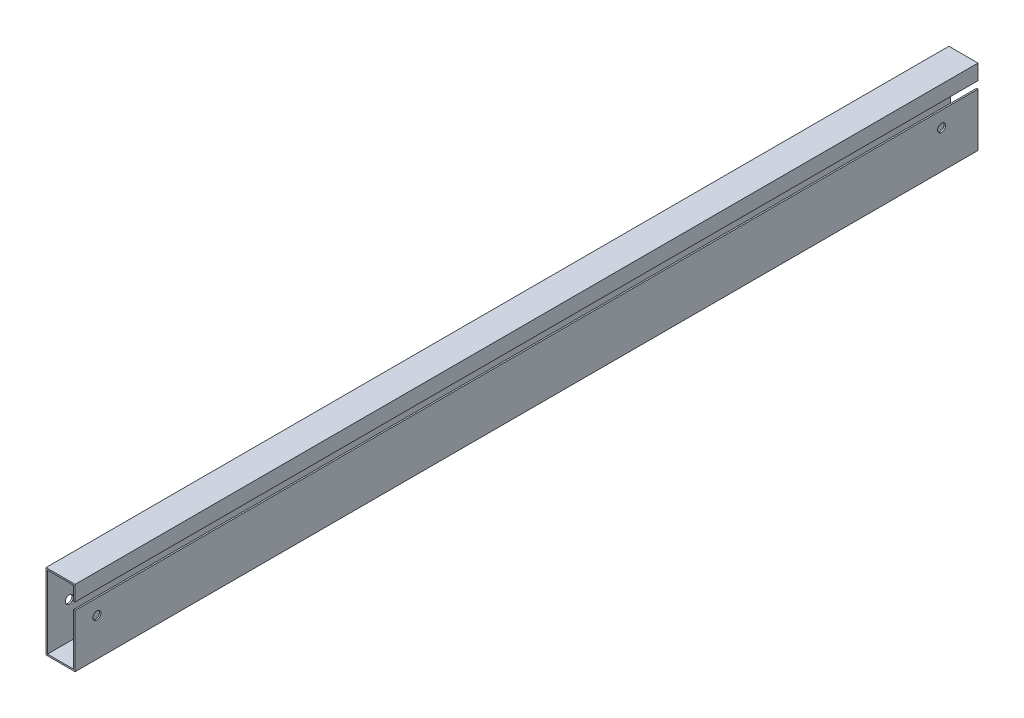
ISO-10303-21;
HEADER;
FILE_DESCRIPTION(('STEP AP214'),'2;1');
FILE_NAME('part.step','',(''),(''),'','','');
FILE_SCHEMA(('AUTOMOTIVE_DESIGN { 1 0 10303 214 1 1 1 1 }'));
ENDSEC;
DATA;
#1=APPLICATION_CONTEXT('core data for automotive mechanical design processes');
#2=APPLICATION_PROTOCOL_DEFINITION('international standard','automotive_design',2000,#1);
#3=PRODUCT_CONTEXT('',#1,'mechanical');
#4=PRODUCT('Part','Part','',(#3));
#5=PRODUCT_RELATED_PRODUCT_CATEGORY('part','',(#4));
#6=PRODUCT_DEFINITION_FORMATION('','',#4);
#7=PRODUCT_DEFINITION_CONTEXT('part definition',#1,'design');
#8=PRODUCT_DEFINITION('design','',#6,#7);
#9=PRODUCT_DEFINITION_SHAPE('','',#8);
#10=(LENGTH_UNIT() NAMED_UNIT(*) SI_UNIT(.MILLI.,.METRE.));
#11=(NAMED_UNIT(*) PLANE_ANGLE_UNIT() SI_UNIT($,.RADIAN.));
#12=(NAMED_UNIT(*) SI_UNIT($,.STERADIAN.) SOLID_ANGLE_UNIT());
#13=UNCERTAINTY_MEASURE_WITH_UNIT(LENGTH_MEASURE(1.E-05),#10,'distance_accuracy_value','');
#14=(GEOMETRIC_REPRESENTATION_CONTEXT(3) GLOBAL_UNCERTAINTY_ASSIGNED_CONTEXT((#13)) GLOBAL_UNIT_ASSIGNED_CONTEXT((#10,
#11,#12)) REPRESENTATION_CONTEXT('',''));
#15=CARTESIAN_POINT('',(0.,0.,0.));
#16=DIRECTION('',(0.,0.,1.));
#17=DIRECTION('',(1.,0.,0.));
#18=AXIS2_PLACEMENT_3D('',#15,#16,#17);
#19=CARTESIAN_POINT('',(9.99999999999999,26.,-620.));
#20=DIRECTION('',(1.,0.,0.));
#21=DIRECTION('',(0.,1.,0.));
#22=AXIS2_PLACEMENT_3D('',#19,#20,#21);
#23=PLANE('',#22);
#24=CARTESIAN_POINT('',(10.,0.,-595.));
#25=DIRECTION('',(1.,0.,0.));
#26=DIRECTION('',(0.,1.,0.));
#27=AXIS2_PLACEMENT_3D('',#24,#25,#26);
#28=CIRCLE('',#27,2.74999999999992);
#29=CARTESIAN_POINT('',(10.,2.74999999999992,-595.));
#30=VERTEX_POINT('',#29);
#31=EDGE_CURVE('E350',#30,#30,#28,.T.);
#32=ORIENTED_EDGE('',*,*,#31,.F.);
#33=EDGE_LOOP('',(#32));
#34=FACE_BOUND('',#33,.T.);
#35=DIRECTION('',(0.,0.,1.));
#36=VECTOR('',#35,1.);
#37=CARTESIAN_POINT('',(10.,10.5,-1200.));
#38=LINE('',#37,#36);
#39=CARTESIAN_POINT('',(10.,10.5,-620.));
#40=VERTEX_POINT('',#39);
#41=CARTESIAN_POINT('',(10.,10.5,0.));
#42=VERTEX_POINT('',#41);
#43=EDGE_CURVE('E135',#40,#42,#38,.T.);
#44=ORIENTED_EDGE('',*,*,#43,.T.);
#45=DIRECTION('',(0.,1.,0.));
#46=VECTOR('',#45,1.);
#47=CARTESIAN_POINT('',(9.99999999999999,26.,0.));
#48=LINE('',#47,#46);
#49=CARTESIAN_POINT('',(10.,-26.,0.));
#50=VERTEX_POINT('',#49);
#51=EDGE_CURVE('E154',#50,#42,#48,.T.);
#52=ORIENTED_EDGE('',*,*,#51,.F.);
#53=DIRECTION('',(0.,0.,1.));
#54=VECTOR('',#53,1.);
#55=CARTESIAN_POINT('',(10.,-26.,-620.));
#56=LINE('',#55,#54);
#57=CARTESIAN_POINT('',(10.,-26.,-620.));
#58=VERTEX_POINT('',#57);
#59=EDGE_CURVE('E179',#58,#50,#56,.T.);
#60=ORIENTED_EDGE('',*,*,#59,.F.);
#61=DIRECTION('',(0.,1.,0.));
#62=VECTOR('',#61,1.);
#63=CARTESIAN_POINT('',(9.99999999999999,26.,-620.));
#64=LINE('',#63,#62);
#65=EDGE_CURVE('E264',#58,#40,#64,.T.);
#66=ORIENTED_EDGE('',*,*,#65,.T.);
#67=EDGE_LOOP('',(#44,#52,#60,#66));
#68=FACE_BOUND('',#67,.T.);
#69=CARTESIAN_POINT('',(10.,0.,-15.));
#70=DIRECTION('',(1.,0.,0.));
#71=DIRECTION('',(0.,1.,0.));
#72=AXIS2_PLACEMENT_3D('',#69,#70,#71);
#73=CIRCLE('',#72,2.75);
#74=CARTESIAN_POINT('',(10.,2.75,-15.));
#75=VERTEX_POINT('',#74);
#76=EDGE_CURVE('E211',#75,#75,#73,.T.);
#77=ORIENTED_EDGE('',*,*,#76,.F.);
#78=EDGE_LOOP('',(#77));
#79=FACE_BOUND('',#78,.T.);
#80=ADVANCED_FACE('F39',(#34,#68,#79),#23,.T.);
#81=CARTESIAN_POINT('',(8.99999999999999,25.,-1200.));
#82=DIRECTION('',(1.,0.,0.));
#83=DIRECTION('',(0.,1.,0.));
#84=AXIS2_PLACEMENT_3D('',#81,#82,#83);
#85=PLANE('',#84);
#86=CARTESIAN_POINT('',(9.,0.,-595.));
#87=DIRECTION('',(1.,0.,0.));
#88=DIRECTION('',(0.,1.,0.));
#89=AXIS2_PLACEMENT_3D('',#86,#87,#88);
#90=CIRCLE('',#89,2.74999999999992);
#91=CARTESIAN_POINT('',(9.,2.74999999999992,-595.));
#92=VERTEX_POINT('',#91);
#93=EDGE_CURVE('E148',#92,#92,#90,.T.);
#94=ORIENTED_EDGE('',*,*,#93,.T.);
#95=EDGE_LOOP('',(#94));
#96=FACE_BOUND('',#95,.T.);
#97=CARTESIAN_POINT('',(9.,0.,-15.));
#98=DIRECTION('',(1.,0.,0.));
#99=DIRECTION('',(0.,1.,0.));
#100=AXIS2_PLACEMENT_3D('',#97,#98,#99);
#101=CIRCLE('',#100,2.75);
#102=CARTESIAN_POINT('',(9.,2.75,-15.));
#103=VERTEX_POINT('',#102);
#104=EDGE_CURVE('E194',#103,#103,#101,.T.);
#105=ORIENTED_EDGE('',*,*,#104,.T.);
#106=EDGE_LOOP('',(#105));
#107=FACE_BOUND('',#106,.T.);
#108=DIRECTION('',(0.,1.,0.));
#109=VECTOR('',#108,1.);
#110=CARTESIAN_POINT('',(8.99999999999999,25.,0.));
#111=LINE('',#110,#109);
#112=CARTESIAN_POINT('',(9.,-25.,0.));
#113=VERTEX_POINT('',#112);
#114=CARTESIAN_POINT('',(9.,10.5,0.));
#115=VERTEX_POINT('',#114);
#116=EDGE_CURVE('E225',#113,#115,#111,.T.);
#117=ORIENTED_EDGE('',*,*,#116,.T.);
#118=DIRECTION('',(0.,0.,-1.));
#119=VECTOR('',#118,1.);
#120=CARTESIAN_POINT('',(8.99999999999999,10.5,-1200.));
#121=LINE('',#120,#119);
#122=CARTESIAN_POINT('',(8.99999999999999,10.5,-620.));
#123=VERTEX_POINT('',#122);
#124=EDGE_CURVE('E11',#115,#123,#121,.T.);
#125=ORIENTED_EDGE('',*,*,#124,.T.);
#126=DIRECTION('',(0.,1.,0.));
#127=VECTOR('',#126,1.);
#128=CARTESIAN_POINT('',(9.,0.,-620.));
#129=LINE('',#128,#127);
#130=CARTESIAN_POINT('',(9.,-25.,-620.));
#131=VERTEX_POINT('',#130);
#132=EDGE_CURVE('E155',#131,#123,#129,.T.);
#133=ORIENTED_EDGE('',*,*,#132,.F.);
#134=DIRECTION('',(0.,0.,1.));
#135=VECTOR('',#134,1.);
#136=CARTESIAN_POINT('',(9.,-25.,-1200.));
#137=LINE('',#136,#135);
#138=EDGE_CURVE('E242',#131,#113,#137,.T.);
#139=ORIENTED_EDGE('',*,*,#138,.T.);
#140=EDGE_LOOP('',(#117,#125,#133,#139));
#141=FACE_BOUND('',#140,.T.);
#142=ADVANCED_FACE('F299',(#96,#107,#141),#85,.F.);
#143=DIRECTION('',(0.,0.,1.));
#144=VECTOR('',#143,1.);
#145=CARTESIAN_POINT('',(10.,15.5,-1200.));
#146=LINE('',#145,#144);
#147=CARTESIAN_POINT('',(10.,15.5,-620.));
#148=VERTEX_POINT('',#147);
#149=CARTESIAN_POINT('',(10.,15.5,0.));
#150=VERTEX_POINT('',#149);
#151=EDGE_CURVE('E127',#148,#150,#146,.T.);
#152=ORIENTED_EDGE('',*,*,#151,.F.);
#153=CARTESIAN_POINT('',(9.99999999999999,26.,-620.));
#154=VERTEX_POINT('',#153);
#155=EDGE_CURVE('E178',#148,#154,#64,.T.);
#156=ORIENTED_EDGE('',*,*,#155,.T.);
#157=DIRECTION('',(0.,0.,1.));
#158=VECTOR('',#157,1.);
#159=CARTESIAN_POINT('',(9.99999999999999,26.,-620.));
#160=LINE('',#159,#158);
#161=CARTESIAN_POINT('',(9.99999999999999,26.,0.));
#162=VERTEX_POINT('',#161);
#163=EDGE_CURVE('E151',#154,#162,#160,.T.);
#164=ORIENTED_EDGE('',*,*,#163,.T.);
#165=EDGE_CURVE('E143',#150,#162,#48,.T.);
#166=ORIENTED_EDGE('',*,*,#165,.F.);
#167=EDGE_LOOP('',(#152,#156,#164,#166));
#168=FACE_BOUND('',#167,.T.);
#169=ADVANCED_FACE('F41',(#168),#23,.T.);
#170=CARTESIAN_POINT('',(-10.,-26.,-620.));
#171=DIRECTION('',(0.,-1.,0.));
#172=DIRECTION('',(0.,0.,-1.));
#173=AXIS2_PLACEMENT_3D('',#170,#171,#172);
#174=PLANE('',#173);
#175=DIRECTION('',(1.,0.,0.));
#176=VECTOR('',#175,1.);
#177=CARTESIAN_POINT('',(-10.,-26.,0.));
#178=LINE('',#177,#176);
#179=CARTESIAN_POINT('',(-10.,-26.,0.));
#180=VERTEX_POINT('',#179);
#181=EDGE_CURVE('E174',#180,#50,#178,.T.);
#182=ORIENTED_EDGE('',*,*,#181,.F.);
#183=DIRECTION('',(0.,0.,1.));
#184=VECTOR('',#183,1.);
#185=CARTESIAN_POINT('',(-10.,-26.,-620.));
#186=LINE('',#185,#184);
#187=CARTESIAN_POINT('',(-10.,-26.,-620.));
#188=VERTEX_POINT('',#187);
#189=EDGE_CURVE('E182',#188,#180,#186,.T.);
#190=ORIENTED_EDGE('',*,*,#189,.F.);
#191=DIRECTION('',(1.,0.,0.));
#192=VECTOR('',#191,1.);
#193=CARTESIAN_POINT('',(-10.,-26.,-620.));
#194=LINE('',#193,#192);
#195=EDGE_CURVE('E166',#188,#58,#194,.T.);
#196=ORIENTED_EDGE('',*,*,#195,.T.);
#197=ORIENTED_EDGE('',*,*,#59,.T.);
#198=EDGE_LOOP('',(#182,#190,#196,#197));
#199=FACE_BOUND('',#198,.T.);
#200=ADVANCED_FACE('F281',(#199),#174,.T.);
#201=CARTESIAN_POINT('',(-10.,26.,-620.));
#202=DIRECTION('',(-1.,0.,0.));
#203=DIRECTION('',(0.,-1.,0.));
#204=AXIS2_PLACEMENT_3D('',#201,#202,#203);
#205=PLANE('',#204);
#206=CARTESIAN_POINT('',(-10.,0.,-595.));
#207=DIRECTION('',(1.,0.,0.));
#208=DIRECTION('',(0.,1.,0.));
#209=AXIS2_PLACEMENT_3D('',#206,#207,#208);
#210=CIRCLE('',#209,2.74999999999992);
#211=CARTESIAN_POINT('',(-10.,2.74999999999992,-595.));
#212=VERTEX_POINT('',#211);
#213=EDGE_CURVE('E357',#212,#212,#210,.T.);
#214=ORIENTED_EDGE('',*,*,#213,.T.);
#215=EDGE_LOOP('',(#214));
#216=FACE_BOUND('',#215,.T.);
#217=CARTESIAN_POINT('',(-10.,0.,-15.));
#218=DIRECTION('',(1.,0.,0.));
#219=DIRECTION('',(0.,1.,0.));
#220=AXIS2_PLACEMENT_3D('',#217,#218,#219);
#221=CIRCLE('',#220,2.75);
#222=CARTESIAN_POINT('',(-10.,2.75,-15.));
#223=VERTEX_POINT('',#222);
#224=EDGE_CURVE('E195',#223,#223,#221,.T.);
#225=ORIENTED_EDGE('',*,*,#224,.T.);
#226=EDGE_LOOP('',(#225));
#227=FACE_BOUND('',#226,.T.);
#228=DIRECTION('',(0.,-1.,0.));
#229=VECTOR('',#228,1.);
#230=CARTESIAN_POINT('',(-10.,26.,0.));
#231=LINE('',#230,#229);
#232=CARTESIAN_POINT('',(-10.,26.,0.));
#233=VERTEX_POINT('',#232);
#234=EDGE_CURVE('E170',#233,#180,#231,.T.);
#235=ORIENTED_EDGE('',*,*,#234,.F.);
#236=DIRECTION('',(0.,0.,1.));
#237=VECTOR('',#236,1.);
#238=CARTESIAN_POINT('',(-10.,26.,-620.));
#239=LINE('',#238,#237);
#240=CARTESIAN_POINT('',(-10.,26.,-620.));
#241=VERTEX_POINT('',#240);
#242=EDGE_CURVE('E185',#241,#233,#239,.T.);
#243=ORIENTED_EDGE('',*,*,#242,.F.);
#244=DIRECTION('',(0.,-1.,0.));
#245=VECTOR('',#244,1.);
#246=CARTESIAN_POINT('',(-10.,26.,-620.));
#247=LINE('',#246,#245);
#248=EDGE_CURVE('E271',#241,#188,#247,.T.);
#249=ORIENTED_EDGE('',*,*,#248,.T.);
#250=ORIENTED_EDGE('',*,*,#189,.T.);
#251=EDGE_LOOP('',(#235,#243,#249,#250));
#252=FACE_BOUND('',#251,.T.);
#253=ADVANCED_FACE('F287',(#216,#227,#252),#205,.T.);
#254=CARTESIAN_POINT('',(-10.,26.,-620.));
#255=DIRECTION('',(0.,1.,0.));
#256=DIRECTION('',(0.,0.,1.));
#257=AXIS2_PLACEMENT_3D('',#254,#255,#256);
#258=PLANE('',#257);
#259=DIRECTION('',(-1.,0.,0.));
#260=VECTOR('',#259,1.);
#261=CARTESIAN_POINT('',(-10.,26.,0.));
#262=LINE('',#261,#260);
#263=EDGE_CURVE('E160',#162,#233,#262,.T.);
#264=ORIENTED_EDGE('',*,*,#263,.F.);
#265=ORIENTED_EDGE('',*,*,#163,.F.);
#266=DIRECTION('',(-1.,0.,0.));
#267=VECTOR('',#266,1.);
#268=CARTESIAN_POINT('',(-10.,26.,-620.));
#269=LINE('',#268,#267);
#270=EDGE_CURVE('E268',#154,#241,#269,.T.);
#271=ORIENTED_EDGE('',*,*,#270,.T.);
#272=ORIENTED_EDGE('',*,*,#242,.T.);
#273=EDGE_LOOP('',(#264,#265,#271,#272));
#274=FACE_BOUND('',#273,.T.);
#275=ADVANCED_FACE('F289',(#274),#258,.T.);
#276=CARTESIAN_POINT('',(0.,0.,-620.));
#277=DIRECTION('',(0.,0.,1.));
#278=DIRECTION('',(1.,0.,0.));
#279=AXIS2_PLACEMENT_3D('',#276,#277,#278);
#280=PLANE('',#279);
#281=ORIENTED_EDGE('',*,*,#132,.T.);
#282=DIRECTION('',(1.,0.,0.));
#283=VECTOR('',#282,1.);
#284=CARTESIAN_POINT('',(0.,10.5,-620.));
#285=LINE('',#284,#283);
#286=EDGE_CURVE('E56',#123,#40,#285,.T.);
#287=ORIENTED_EDGE('',*,*,#286,.T.);
#288=ORIENTED_EDGE('',*,*,#65,.F.);
#289=ORIENTED_EDGE('',*,*,#195,.F.);
#290=ORIENTED_EDGE('',*,*,#248,.F.);
#291=ORIENTED_EDGE('',*,*,#270,.F.);
#292=ORIENTED_EDGE('',*,*,#155,.F.);
#293=DIRECTION('',(-1.,0.,0.));
#294=VECTOR('',#293,1.);
#295=CARTESIAN_POINT('',(0.,15.5,-620.));
#296=LINE('',#295,#294);
#297=CARTESIAN_POINT('',(9.,15.5,-620.));
#298=VERTEX_POINT('',#297);
#299=EDGE_CURVE('E130',#148,#298,#296,.T.);
#300=ORIENTED_EDGE('',*,*,#299,.T.);
#301=CARTESIAN_POINT('',(8.99999999999999,25.,-620.));
#302=VERTEX_POINT('',#301);
#303=EDGE_CURVE('E162',#298,#302,#129,.T.);
#304=ORIENTED_EDGE('',*,*,#303,.T.);
#305=DIRECTION('',(-1.,0.,0.));
#306=VECTOR('',#305,1.);
#307=CARTESIAN_POINT('',(0.,25.,-620.));
#308=LINE('',#307,#306);
#309=CARTESIAN_POINT('',(-9.00000000000001,25.,-620.));
#310=VERTEX_POINT('',#309);
#311=EDGE_CURVE('E245',#302,#310,#308,.T.);
#312=ORIENTED_EDGE('',*,*,#311,.T.);
#313=DIRECTION('',(0.,-1.,0.));
#314=VECTOR('',#313,1.);
#315=CARTESIAN_POINT('',(-9.,0.,-620.));
#316=LINE('',#315,#314);
#317=CARTESIAN_POINT('',(-9.,-25.,-620.));
#318=VERTEX_POINT('',#317);
#319=EDGE_CURVE('E256',#310,#318,#316,.T.);
#320=ORIENTED_EDGE('',*,*,#319,.T.);
#321=DIRECTION('',(1.,0.,0.));
#322=VECTOR('',#321,1.);
#323=CARTESIAN_POINT('',(0.,-25.,-620.));
#324=LINE('',#323,#322);
#325=EDGE_CURVE('E260',#318,#131,#324,.T.);
#326=ORIENTED_EDGE('',*,*,#325,.T.);
#327=EDGE_LOOP('',(#281,#287,#288,#289,#290,#291,#292,#300,#304,#312,#320,#326));
#328=FACE_BOUND('',#327,.T.);
#329=ADVANCED_FACE('F203',(#328),#280,.F.);
#330=CARTESIAN_POINT('',(0.,0.,0.));
#331=DIRECTION('',(0.,0.,1.));
#332=DIRECTION('',(1.,0.,0.));
#333=AXIS2_PLACEMENT_3D('',#330,#331,#332);
#334=PLANE('',#333);
#335=DIRECTION('',(1.,0.,0.));
#336=VECTOR('',#335,1.);
#337=CARTESIAN_POINT('',(9.,10.5,0.));
#338=LINE('',#337,#336);
#339=EDGE_CURVE('E136',#115,#42,#338,.T.);
#340=ORIENTED_EDGE('',*,*,#339,.F.);
#341=ORIENTED_EDGE('',*,*,#116,.F.);
#342=DIRECTION('',(1.,0.,0.));
#343=VECTOR('',#342,1.);
#344=CARTESIAN_POINT('',(-9.,-25.,0.));
#345=LINE('',#344,#343);
#346=CARTESIAN_POINT('',(-9.,-25.,0.));
#347=VERTEX_POINT('',#346);
#348=EDGE_CURVE('E237',#347,#113,#345,.T.);
#349=ORIENTED_EDGE('',*,*,#348,.F.);
#350=DIRECTION('',(0.,-1.,0.));
#351=VECTOR('',#350,1.);
#352=CARTESIAN_POINT('',(-9.00000000000001,25.,0.));
#353=LINE('',#352,#351);
#354=CARTESIAN_POINT('',(-9.00000000000001,25.,0.));
#355=VERTEX_POINT('',#354);
#356=EDGE_CURVE('E233',#355,#347,#353,.T.);
#357=ORIENTED_EDGE('',*,*,#356,.F.);
#358=DIRECTION('',(-1.,0.,0.));
#359=VECTOR('',#358,1.);
#360=CARTESIAN_POINT('',(-9.00000000000001,25.,0.));
#361=LINE('',#360,#359);
#362=CARTESIAN_POINT('',(8.99999999999999,25.,0.));
#363=VERTEX_POINT('',#362);
#364=EDGE_CURVE('E229',#363,#355,#361,.T.);
#365=ORIENTED_EDGE('',*,*,#364,.F.);
#366=CARTESIAN_POINT('',(8.99999999999999,15.5,0.));
#367=VERTEX_POINT('',#366);
#368=EDGE_CURVE('E146',#367,#363,#111,.T.);
#369=ORIENTED_EDGE('',*,*,#368,.F.);
#370=DIRECTION('',(-1.,0.,0.));
#371=VECTOR('',#370,1.);
#372=CARTESIAN_POINT('',(9.,15.5,0.));
#373=LINE('',#372,#371);
#374=EDGE_CURVE('E63',#150,#367,#373,.T.);
#375=ORIENTED_EDGE('',*,*,#374,.F.);
#376=ORIENTED_EDGE('',*,*,#165,.T.);
#377=ORIENTED_EDGE('',*,*,#263,.T.);
#378=ORIENTED_EDGE('',*,*,#234,.T.);
#379=ORIENTED_EDGE('',*,*,#181,.T.);
#380=ORIENTED_EDGE('',*,*,#51,.T.);
#381=EDGE_LOOP('',(#340,#341,#349,#357,#365,#369,#375,#376,#377,#378,#379,#380));
#382=FACE_BOUND('',#381,.T.);
#383=ADVANCED_FACE('F141',(#382),#334,.T.);
#384=ORIENTED_EDGE('',*,*,#303,.F.);
#385=DIRECTION('',(0.,0.,1.));
#386=VECTOR('',#385,1.);
#387=CARTESIAN_POINT('',(8.99999999999999,15.5,-1200.));
#388=LINE('',#387,#386);
#389=EDGE_CURVE('E49',#298,#367,#388,.T.);
#390=ORIENTED_EDGE('',*,*,#389,.T.);
#391=ORIENTED_EDGE('',*,*,#368,.T.);
#392=DIRECTION('',(0.,0.,1.));
#393=VECTOR('',#392,1.);
#394=CARTESIAN_POINT('',(8.99999999999999,25.,-1200.));
#395=LINE('',#394,#393);
#396=EDGE_CURVE('E241',#302,#363,#395,.T.);
#397=ORIENTED_EDGE('',*,*,#396,.F.);
#398=EDGE_LOOP('',(#384,#390,#391,#397));
#399=FACE_BOUND('',#398,.T.);
#400=ADVANCED_FACE('F199',(#399),#85,.F.);
#401=CARTESIAN_POINT('',(-9.,-25.,-1200.));
#402=DIRECTION('',(0.,-1.,0.));
#403=DIRECTION('',(0.,0.,-1.));
#404=AXIS2_PLACEMENT_3D('',#401,#402,#403);
#405=PLANE('',#404);
#406=DIRECTION('',(0.,0.,1.));
#407=VECTOR('',#406,1.);
#408=CARTESIAN_POINT('',(-9.,-25.,-1200.));
#409=LINE('',#408,#407);
#410=EDGE_CURVE('E246',#318,#347,#409,.T.);
#411=ORIENTED_EDGE('',*,*,#410,.T.);
#412=ORIENTED_EDGE('',*,*,#348,.T.);
#413=ORIENTED_EDGE('',*,*,#138,.F.);
#414=ORIENTED_EDGE('',*,*,#325,.F.);
#415=EDGE_LOOP('',(#411,#412,#413,#414));
#416=FACE_BOUND('',#415,.T.);
#417=ADVANCED_FACE('F318',(#416),#405,.F.);
#418=CARTESIAN_POINT('',(-9.00000000000001,25.,-1200.));
#419=DIRECTION('',(-1.,0.,0.));
#420=DIRECTION('',(0.,-1.,0.));
#421=AXIS2_PLACEMENT_3D('',#418,#419,#420);
#422=PLANE('',#421);
#423=CARTESIAN_POINT('',(-9.,0.,-595.));
#424=DIRECTION('',(-1.,0.,0.));
#425=DIRECTION('',(0.,-1.,0.));
#426=AXIS2_PLACEMENT_3D('',#423,#424,#425);
#427=CIRCLE('',#426,2.74999999999992);
#428=CARTESIAN_POINT('',(-9.,-2.74999999999992,-595.));
#429=VERTEX_POINT('',#428);
#430=EDGE_CURVE('E43',#429,#429,#427,.T.);
#431=ORIENTED_EDGE('',*,*,#430,.T.);
#432=EDGE_LOOP('',(#431));
#433=FACE_BOUND('',#432,.T.);
#434=CARTESIAN_POINT('',(-9.,0.,-15.));
#435=DIRECTION('',(-1.,0.,0.));
#436=DIRECTION('',(0.,-1.,0.));
#437=AXIS2_PLACEMENT_3D('',#434,#435,#436);
#438=CIRCLE('',#437,2.75);
#439=CARTESIAN_POINT('',(-9.,-2.75,-15.));
#440=VERTEX_POINT('',#439);
#441=EDGE_CURVE('E190',#440,#440,#438,.T.);
#442=ORIENTED_EDGE('',*,*,#441,.T.);
#443=EDGE_LOOP('',(#442));
#444=FACE_BOUND('',#443,.T.);
#445=DIRECTION('',(0.,0.,1.));
#446=VECTOR('',#445,1.);
#447=CARTESIAN_POINT('',(-9.00000000000001,25.,-1200.));
#448=LINE('',#447,#446);
#449=EDGE_CURVE('E249',#310,#355,#448,.T.);
#450=ORIENTED_EDGE('',*,*,#449,.T.);
#451=ORIENTED_EDGE('',*,*,#356,.T.);
#452=ORIENTED_EDGE('',*,*,#410,.F.);
#453=ORIENTED_EDGE('',*,*,#319,.F.);
#454=EDGE_LOOP('',(#450,#451,#452,#453));
#455=FACE_BOUND('',#454,.T.);
#456=ADVANCED_FACE('F323',(#433,#444,#455),#422,.F.);
#457=CARTESIAN_POINT('',(-9.00000000000001,25.,-1200.));
#458=DIRECTION('',(0.,1.,0.));
#459=DIRECTION('',(0.,0.,1.));
#460=AXIS2_PLACEMENT_3D('',#457,#458,#459);
#461=PLANE('',#460);
#462=ORIENTED_EDGE('',*,*,#396,.T.);
#463=ORIENTED_EDGE('',*,*,#364,.T.);
#464=ORIENTED_EDGE('',*,*,#449,.F.);
#465=ORIENTED_EDGE('',*,*,#311,.F.);
#466=EDGE_LOOP('',(#462,#463,#464,#465));
#467=FACE_BOUND('',#466,.T.);
#468=ADVANCED_FACE('F319',(#467),#461,.F.);
#469=CARTESIAN_POINT('',(-10.,0.,-15.));
#470=DIRECTION('',(1.,0.,0.));
#471=DIRECTION('',(0.,1.,0.));
#472=AXIS2_PLACEMENT_3D('',#469,#470,#471);
#473=CYLINDRICAL_SURFACE('',#472,2.75);
#474=ORIENTED_EDGE('',*,*,#224,.F.);
#475=EDGE_LOOP('',(#474));
#476=FACE_BOUND('',#475,.T.);
#477=ORIENTED_EDGE('',*,*,#441,.F.);
#478=EDGE_LOOP('',(#477));
#479=FACE_BOUND('',#478,.T.);
#480=ADVANCED_FACE('F322',(#476,#479),#473,.F.);
#481=ORIENTED_EDGE('',*,*,#76,.T.);
#482=EDGE_LOOP('',(#481));
#483=FACE_BOUND('',#482,.T.);
#484=ORIENTED_EDGE('',*,*,#104,.F.);
#485=EDGE_LOOP('',(#484));
#486=FACE_BOUND('',#485,.T.);
#487=ADVANCED_FACE('F331',(#483,#486),#473,.F.);
#488=CARTESIAN_POINT('',(9.,15.5,-1200.));
#489=DIRECTION('',(0.,1.,0.));
#490=DIRECTION('',(0.,0.,1.));
#491=AXIS2_PLACEMENT_3D('',#488,#489,#490);
#492=PLANE('',#491);
#493=ORIENTED_EDGE('',*,*,#151,.T.);
#494=ORIENTED_EDGE('',*,*,#374,.T.);
#495=ORIENTED_EDGE('',*,*,#389,.F.);
#496=ORIENTED_EDGE('',*,*,#299,.F.);
#497=EDGE_LOOP('',(#493,#494,#495,#496));
#498=FACE_BOUND('',#497,.T.);
#499=ADVANCED_FACE('F128',(#498),#492,.F.);
#500=CARTESIAN_POINT('',(9.,10.5,-1200.));
#501=DIRECTION('',(0.,-1.,0.));
#502=DIRECTION('',(0.,0.,-1.));
#503=AXIS2_PLACEMENT_3D('',#500,#501,#502);
#504=PLANE('',#503);
#505=ORIENTED_EDGE('',*,*,#124,.F.);
#506=ORIENTED_EDGE('',*,*,#339,.T.);
#507=ORIENTED_EDGE('',*,*,#43,.F.);
#508=ORIENTED_EDGE('',*,*,#286,.F.);
#509=EDGE_LOOP('',(#505,#506,#507,#508));
#510=FACE_BOUND('',#509,.T.);
#511=ADVANCED_FACE('F337',(#510),#504,.F.);
#512=CARTESIAN_POINT('',(-10.,0.,-595.));
#513=DIRECTION('',(1.,0.,0.));
#514=DIRECTION('',(0.,1.,0.));
#515=AXIS2_PLACEMENT_3D('',#512,#513,#514);
#516=CYLINDRICAL_SURFACE('',#515,2.74999999999992);
#517=ORIENTED_EDGE('',*,*,#213,.F.);
#518=EDGE_LOOP('',(#517));
#519=FACE_BOUND('',#518,.T.);
#520=ORIENTED_EDGE('',*,*,#430,.F.);
#521=EDGE_LOOP('',(#520));
#522=FACE_BOUND('',#521,.T.);
#523=ADVANCED_FACE('F340',(#519,#522),#516,.F.);
#524=ORIENTED_EDGE('',*,*,#31,.T.);
#525=EDGE_LOOP('',(#524));
#526=FACE_BOUND('',#525,.T.);
#527=ORIENTED_EDGE('',*,*,#93,.F.);
#528=EDGE_LOOP('',(#527));
#529=FACE_BOUND('',#528,.T.);
#530=ADVANCED_FACE('F341',(#526,#529),#516,.F.);
#531=CLOSED_SHELL('',(#80,#142,#169,#200,#253,#275,#329,#383,#400,#417,#456,#468,#480,#487,#499,
#511,#523,#530));
#532=MANIFOLD_SOLID_BREP('B2',#531);
#533=ADVANCED_BREP_SHAPE_REPRESENTATION('',(#18,#532),#14);
#534=SHAPE_DEFINITION_REPRESENTATION(#9,#533);
ENDSEC;
END-ISO-10303-21;
